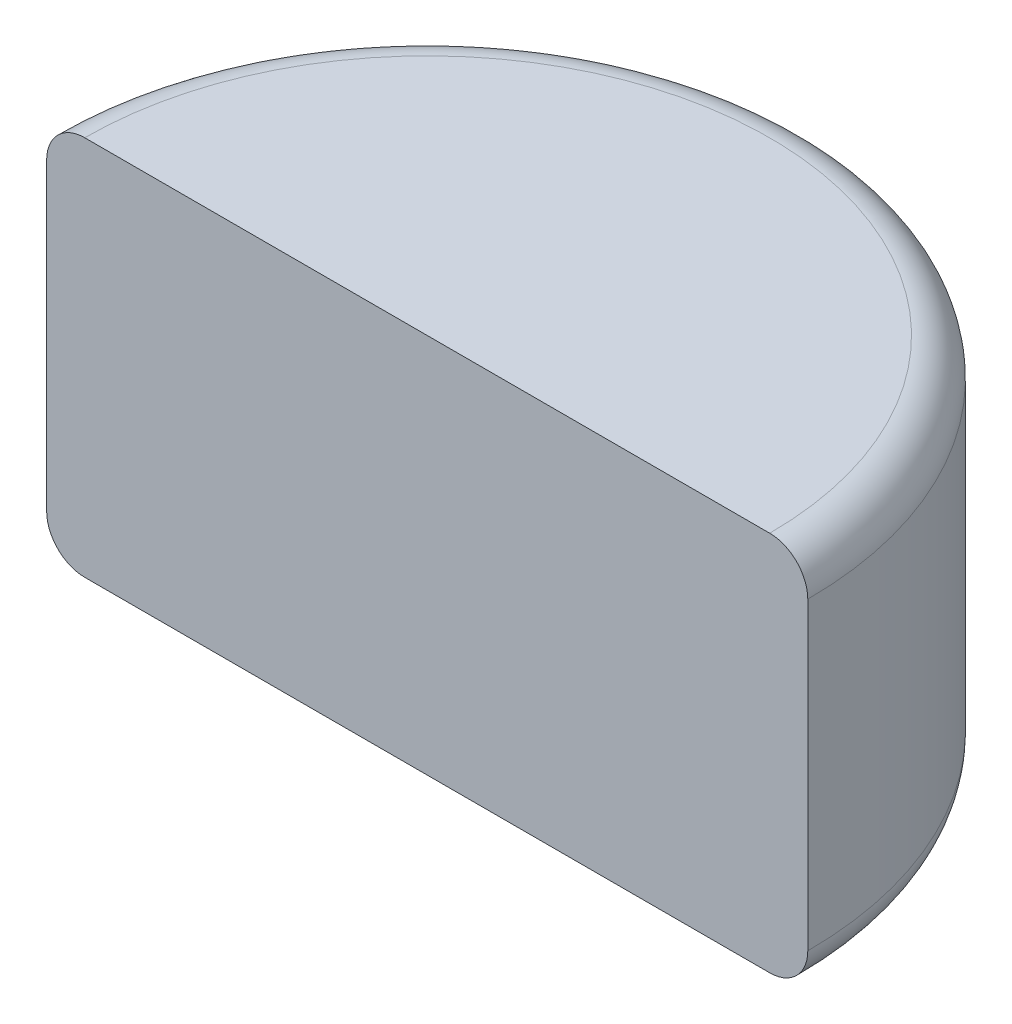
ISO-10303-21;
HEADER;
FILE_DESCRIPTION(('STEP AP214'),'2;1');
FILE_NAME('part.step','',(''),(''),'','','');
FILE_SCHEMA(('AUTOMOTIVE_DESIGN { 1 0 10303 214 1 1 1 1 }'));
ENDSEC;
DATA;
#1=APPLICATION_CONTEXT('core data for automotive mechanical design processes');
#2=APPLICATION_PROTOCOL_DEFINITION('international standard','automotive_design',2000,#1);
#3=PRODUCT_CONTEXT('',#1,'mechanical');
#4=PRODUCT('Part','Part','',(#3));
#5=PRODUCT_RELATED_PRODUCT_CATEGORY('part','',(#4));
#6=PRODUCT_DEFINITION_FORMATION('','',#4);
#7=PRODUCT_DEFINITION_CONTEXT('part definition',#1,'design');
#8=PRODUCT_DEFINITION('design','',#6,#7);
#9=PRODUCT_DEFINITION_SHAPE('','',#8);
#10=(LENGTH_UNIT() NAMED_UNIT(*) SI_UNIT(.MILLI.,.METRE.));
#11=(NAMED_UNIT(*) PLANE_ANGLE_UNIT() SI_UNIT($,.RADIAN.));
#12=(NAMED_UNIT(*) SI_UNIT($,.STERADIAN.) SOLID_ANGLE_UNIT());
#13=UNCERTAINTY_MEASURE_WITH_UNIT(LENGTH_MEASURE(1.E-05),#10,'distance_accuracy_value','');
#14=(GEOMETRIC_REPRESENTATION_CONTEXT(3) GLOBAL_UNCERTAINTY_ASSIGNED_CONTEXT((#13)) GLOBAL_UNIT_ASSIGNED_CONTEXT((#10,
#11,#12)) REPRESENTATION_CONTEXT('',''));
#15=CARTESIAN_POINT('',(0.,0.,0.));
#16=DIRECTION('',(0.,0.,1.));
#17=DIRECTION('',(1.,0.,0.));
#18=AXIS2_PLACEMENT_3D('',#15,#16,#17);
#19=CARTESIAN_POINT('',(25.389274028451,25.4,0.));
#20=DIRECTION('',(0.,-1.,0.));
#21=DIRECTION('',(0.,0.,-1.));
#22=AXIS2_PLACEMENT_3D('',#19,#20,#21);
#23=CYLINDRICAL_SURFACE('',#22,25.389274028451);
#24=DIRECTION('',(0.,-1.,0.));
#25=VECTOR('',#24,1.);
#26=CARTESIAN_POINT('',(50.7785480569019,25.4,0.));
#27=LINE('',#26,#25);
#28=CARTESIAN_POINT('',(50.7785480569019,22.86,0.));
#29=VERTEX_POINT('',#28);
#30=CARTESIAN_POINT('',(50.7785480569019,2.54,0.));
#31=VERTEX_POINT('',#30);
#32=EDGE_CURVE('E117',#29,#31,#27,.T.);
#33=ORIENTED_EDGE('',*,*,#32,.T.);
#34=CARTESIAN_POINT('',(25.389274028451,2.54,0.));
#35=DIRECTION('',(0.,-1.,0.));
#36=DIRECTION('',(0.,0.,-1.));
#37=AXIS2_PLACEMENT_3D('',#34,#35,#36);
#38=CIRCLE('',#37,25.389274028451);
#39=CARTESIAN_POINT('',(0.,2.54,0.));
#40=VERTEX_POINT('',#39);
#41=EDGE_CURVE('E52',#31,#40,#38,.F.);
#42=ORIENTED_EDGE('',*,*,#41,.T.);
#43=DIRECTION('',(0.,-1.,0.));
#44=VECTOR('',#43,1.);
#45=CARTESIAN_POINT('',(0.,25.4,0.));
#46=LINE('',#45,#44);
#47=CARTESIAN_POINT('',(0.,22.86,0.));
#48=VERTEX_POINT('',#47);
#49=EDGE_CURVE('E96',#48,#40,#46,.T.);
#50=ORIENTED_EDGE('',*,*,#49,.F.);
#51=CARTESIAN_POINT('',(25.389274028451,22.86,0.));
#52=DIRECTION('',(0.,-1.,0.));
#53=DIRECTION('',(0.,0.,-1.));
#54=AXIS2_PLACEMENT_3D('',#51,#52,#53);
#55=CIRCLE('',#54,25.389274028451);
#56=EDGE_CURVE('E125',#48,#29,#55,.T.);
#57=ORIENTED_EDGE('',*,*,#56,.T.);
#58=EDGE_LOOP('',(#33,#42,#50,#57));
#59=FACE_BOUND('',#58,.T.);
#60=ADVANCED_FACE('F43',(#59),#23,.T.);
#61=CARTESIAN_POINT('',(0.,25.4,0.));
#62=DIRECTION('',(0.,0.,-1.));
#63=DIRECTION('',(-1.,0.,0.));
#64=AXIS2_PLACEMENT_3D('',#61,#62,#63);
#65=PLANE('',#64);
#66=DIRECTION('',(1.,0.,0.));
#67=VECTOR('',#66,1.);
#68=CARTESIAN_POINT('',(0.,0.,0.));
#69=LINE('',#68,#67);
#70=CARTESIAN_POINT('',(2.54,0.,0.));
#71=VERTEX_POINT('',#70);
#72=CARTESIAN_POINT('',(48.2385480569019,0.,0.));
#73=VERTEX_POINT('',#72);
#74=EDGE_CURVE('E95',#71,#73,#69,.T.);
#75=ORIENTED_EDGE('',*,*,#74,.T.);
#76=CARTESIAN_POINT('',(48.2385480569019,2.54,0.));
#77=DIRECTION('',(0.,0.,-1.));
#78=DIRECTION('',(-1.,0.,0.));
#79=AXIS2_PLACEMENT_3D('',#76,#77,#78);
#80=CIRCLE('',#79,2.54);
#81=EDGE_CURVE('E100',#73,#31,#80,.F.);
#82=ORIENTED_EDGE('',*,*,#81,.T.);
#83=ORIENTED_EDGE('',*,*,#32,.F.);
#84=CARTESIAN_POINT('',(48.2385480569019,22.86,0.));
#85=DIRECTION('',(0.,0.,-1.));
#86=DIRECTION('',(-1.,0.,0.));
#87=AXIS2_PLACEMENT_3D('',#84,#85,#86);
#88=CIRCLE('',#87,2.54);
#89=CARTESIAN_POINT('',(48.2385480569019,25.4,0.));
#90=VERTEX_POINT('',#89);
#91=EDGE_CURVE('E101',#29,#90,#88,.F.);
#92=ORIENTED_EDGE('',*,*,#91,.T.);
#93=DIRECTION('',(1.,0.,0.));
#94=VECTOR('',#93,1.);
#95=CARTESIAN_POINT('',(0.,25.4,0.));
#96=LINE('',#95,#94);
#97=CARTESIAN_POINT('',(2.54,25.4,0.));
#98=VERTEX_POINT('',#97);
#99=EDGE_CURVE('E108',#98,#90,#96,.T.);
#100=ORIENTED_EDGE('',*,*,#99,.F.);
#101=CARTESIAN_POINT('',(2.54,22.86,0.));
#102=DIRECTION('',(0.,0.,-1.));
#103=DIRECTION('',(-1.,0.,0.));
#104=AXIS2_PLACEMENT_3D('',#101,#102,#103);
#105=CIRCLE('',#104,2.54);
#106=EDGE_CURVE('E70',#98,#48,#105,.F.);
#107=ORIENTED_EDGE('',*,*,#106,.T.);
#108=ORIENTED_EDGE('',*,*,#49,.T.);
#109=CARTESIAN_POINT('',(2.54,2.54,0.));
#110=DIRECTION('',(0.,0.,-1.));
#111=DIRECTION('',(-1.,0.,0.));
#112=AXIS2_PLACEMENT_3D('',#109,#110,#111);
#113=CIRCLE('',#112,2.54);
#114=EDGE_CURVE('E92',#40,#71,#113,.F.);
#115=ORIENTED_EDGE('',*,*,#114,.T.);
#116=EDGE_LOOP('',(#75,#82,#83,#92,#100,#107,#108,#115));
#117=FACE_BOUND('',#116,.T.);
#118=ADVANCED_FACE('F94',(#117),#65,.F.);
#119=CARTESIAN_POINT('',(25.389274028451,25.4,0.));
#120=DIRECTION('',(0.,-1.,0.));
#121=DIRECTION('',(0.,0.,-1.));
#122=AXIS2_PLACEMENT_3D('',#119,#120,#121);
#123=PLANE('',#122);
#124=ORIENTED_EDGE('',*,*,#99,.T.);
#125=CARTESIAN_POINT('',(25.389274028451,25.4,0.));
#126=DIRECTION('',(0.,-1.,0.));
#127=DIRECTION('',(0.,0.,-1.));
#128=AXIS2_PLACEMENT_3D('',#125,#126,#127);
#129=CIRCLE('',#128,22.849274028451);
#130=EDGE_CURVE('E12',#90,#98,#129,.F.);
#131=ORIENTED_EDGE('',*,*,#130,.T.);
#132=EDGE_LOOP('',(#124,#131));
#133=FACE_BOUND('',#132,.T.);
#134=ADVANCED_FACE('F146',(#133),#123,.F.);
#135=CARTESIAN_POINT('',(25.389274028451,0.,0.));
#136=DIRECTION('',(0.,-1.,0.));
#137=DIRECTION('',(0.,0.,-1.));
#138=AXIS2_PLACEMENT_3D('',#135,#136,#137);
#139=PLANE('',#138);
#140=ORIENTED_EDGE('',*,*,#74,.F.);
#141=CARTESIAN_POINT('',(25.389274028451,0.,0.));
#142=DIRECTION('',(0.,-1.,0.));
#143=DIRECTION('',(0.,0.,-1.));
#144=AXIS2_PLACEMENT_3D('',#141,#142,#143);
#145=CIRCLE('',#144,22.849274028451);
#146=EDGE_CURVE('E106',#71,#73,#145,.T.);
#147=ORIENTED_EDGE('',*,*,#146,.T.);
#148=EDGE_LOOP('',(#140,#147));
#149=FACE_BOUND('',#148,.T.);
#150=ADVANCED_FACE('F105',(#149),#139,.T.);
#151=CARTESIAN_POINT('',(25.389274028451,2.54,0.));
#152=DIRECTION('',(0.,-1.,0.));
#153=DIRECTION('',(0.,0.,-1.));
#154=AXIS2_PLACEMENT_3D('',#151,#152,#153);
#155=TOROIDAL_SURFACE('',#154,22.849274028451,2.54);
#156=ORIENTED_EDGE('',*,*,#114,.F.);
#157=ORIENTED_EDGE('',*,*,#41,.F.);
#158=ORIENTED_EDGE('',*,*,#81,.F.);
#159=ORIENTED_EDGE('',*,*,#146,.F.);
#160=EDGE_LOOP('',(#156,#157,#158,#159));
#161=FACE_BOUND('',#160,.T.);
#162=ADVANCED_FACE('F110',(#161),#155,.T.);
#163=CARTESIAN_POINT('',(25.389274028451,22.86,0.));
#164=DIRECTION('',(0.,-1.,0.));
#165=DIRECTION('',(0.,0.,-1.));
#166=AXIS2_PLACEMENT_3D('',#163,#164,#165);
#167=TOROIDAL_SURFACE('',#166,22.849274028451,2.54);
#168=ORIENTED_EDGE('',*,*,#106,.F.);
#169=ORIENTED_EDGE('',*,*,#130,.F.);
#170=ORIENTED_EDGE('',*,*,#91,.F.);
#171=ORIENTED_EDGE('',*,*,#56,.F.);
#172=EDGE_LOOP('',(#168,#169,#170,#171));
#173=FACE_BOUND('',#172,.T.);
#174=ADVANCED_FACE('F45',(#173),#167,.T.);
#175=CLOSED_SHELL('',(#60,#118,#134,#150,#162,#174));
#176=MANIFOLD_SOLID_BREP('B2',#175);
#177=ADVANCED_BREP_SHAPE_REPRESENTATION('',(#18,#176),#14);
#178=SHAPE_DEFINITION_REPRESENTATION(#9,#177);
ENDSEC;
END-ISO-10303-21;
